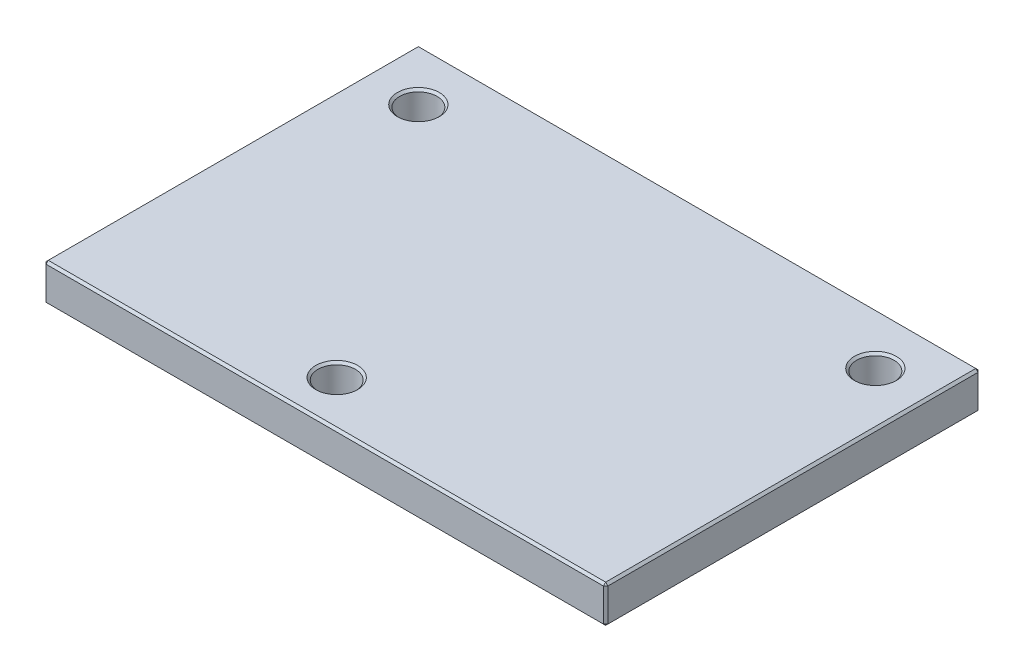
ISO-10303-21;
HEADER;
FILE_DESCRIPTION(('STEP AP214'),'2;1');
FILE_NAME('part.step','',(''),(''),'','','');
FILE_SCHEMA(('AUTOMOTIVE_DESIGN { 1 0 10303 214 1 1 1 1 }'));
ENDSEC;
DATA;
#1=APPLICATION_CONTEXT('core data for automotive mechanical design processes');
#2=APPLICATION_PROTOCOL_DEFINITION('international standard','automotive_design',2000,#1);
#3=PRODUCT_CONTEXT('',#1,'mechanical');
#4=PRODUCT('Part','Part','',(#3));
#5=PRODUCT_RELATED_PRODUCT_CATEGORY('part','',(#4));
#6=PRODUCT_DEFINITION_FORMATION('','',#4);
#7=PRODUCT_DEFINITION_CONTEXT('part definition',#1,'design');
#8=PRODUCT_DEFINITION('design','',#6,#7);
#9=PRODUCT_DEFINITION_SHAPE('','',#8);
#10=(LENGTH_UNIT() NAMED_UNIT(*) SI_UNIT(.MILLI.,.METRE.));
#11=(NAMED_UNIT(*) PLANE_ANGLE_UNIT() SI_UNIT($,.RADIAN.));
#12=(NAMED_UNIT(*) SI_UNIT($,.STERADIAN.) SOLID_ANGLE_UNIT());
#13=UNCERTAINTY_MEASURE_WITH_UNIT(LENGTH_MEASURE(1.E-05),#10,'distance_accuracy_value','');
#14=(GEOMETRIC_REPRESENTATION_CONTEXT(3) GLOBAL_UNCERTAINTY_ASSIGNED_CONTEXT((#13)) GLOBAL_UNIT_ASSIGNED_CONTEXT((#10,
#11,#12)) REPRESENTATION_CONTEXT('',''));
#15=CARTESIAN_POINT('',(0.,0.,0.));
#16=DIRECTION('',(0.,0.,1.));
#17=DIRECTION('',(1.,0.,0.));
#18=AXIS2_PLACEMENT_3D('',#15,#16,#17);
#19=CARTESIAN_POINT('',(375.,-50.,250.));
#20=DIRECTION('',(1.,0.,0.));
#21=DIRECTION('',(0.,0.,-1.));
#22=AXIS2_PLACEMENT_3D('',#19,#20,#21);
#23=PLANE('',#22);
#24=DIRECTION('',(0.,0.,-1.));
#25=VECTOR('',#24,1.);
#26=CARTESIAN_POINT('',(375.,-46.9999999999998,250.));
#27=LINE('',#26,#25);
#28=CARTESIAN_POINT('',(375.,-46.9999999999998,247.));
#29=VERTEX_POINT('',#28);
#30=CARTESIAN_POINT('',(375.,-46.9999999999998,-247.));
#31=VERTEX_POINT('',#30);
#32=EDGE_CURVE('E190',#29,#31,#27,.T.);
#33=ORIENTED_EDGE('',*,*,#32,.T.);
#34=DIRECTION('',(0.,1.,0.));
#35=VECTOR('',#34,1.);
#36=CARTESIAN_POINT('',(375.,-50.,-247.));
#37=LINE('',#36,#35);
#38=CARTESIAN_POINT('',(375.,-3.00000000000022,-247.));
#39=VERTEX_POINT('',#38);
#40=EDGE_CURVE('E192',#31,#39,#37,.T.);
#41=ORIENTED_EDGE('',*,*,#40,.T.);
#42=DIRECTION('',(0.,0.,1.));
#43=VECTOR('',#42,1.);
#44=CARTESIAN_POINT('',(375.,-3.00000000000022,250.));
#45=LINE('',#44,#43);
#46=CARTESIAN_POINT('',(375.,-3.00000000000022,247.));
#47=VERTEX_POINT('',#46);
#48=EDGE_CURVE('E188',#39,#47,#45,.T.);
#49=ORIENTED_EDGE('',*,*,#48,.T.);
#50=DIRECTION('',(0.,-1.,0.));
#51=VECTOR('',#50,1.);
#52=CARTESIAN_POINT('',(375.,-50.,247.));
#53=LINE('',#52,#51);
#54=EDGE_CURVE('E186',#47,#29,#53,.T.);
#55=ORIENTED_EDGE('',*,*,#54,.T.);
#56=EDGE_LOOP('',(#33,#41,#49,#55));
#57=FACE_BOUND('',#56,.T.);
#58=ADVANCED_FACE('F42',(#57),#23,.T.);
#59=CARTESIAN_POINT('',(-375.,-50.,250.));
#60=DIRECTION('',(0.,0.,1.));
#61=DIRECTION('',(1.,0.,0.));
#62=AXIS2_PLACEMENT_3D('',#59,#60,#61);
#63=PLANE('',#62);
#64=DIRECTION('',(1.,0.,0.));
#65=VECTOR('',#64,1.);
#66=CARTESIAN_POINT('',(-375.,-46.9999999999998,250.));
#67=LINE('',#66,#65);
#68=CARTESIAN_POINT('',(-372.,-46.9999999999998,250.));
#69=VERTEX_POINT('',#68);
#70=CARTESIAN_POINT('',(372.,-46.9999999999998,250.));
#71=VERTEX_POINT('',#70);
#72=EDGE_CURVE('E199',#69,#71,#67,.T.);
#73=ORIENTED_EDGE('',*,*,#72,.T.);
#74=DIRECTION('',(0.,1.,0.));
#75=VECTOR('',#74,1.);
#76=CARTESIAN_POINT('',(372.,-50.,250.));
#77=LINE('',#76,#75);
#78=CARTESIAN_POINT('',(372.,-3.00000000000022,250.));
#79=VERTEX_POINT('',#78);
#80=EDGE_CURVE('E201',#71,#79,#77,.T.);
#81=ORIENTED_EDGE('',*,*,#80,.T.);
#82=DIRECTION('',(-1.,0.,0.));
#83=VECTOR('',#82,1.);
#84=CARTESIAN_POINT('',(-375.,-3.00000000000022,250.));
#85=LINE('',#84,#83);
#86=CARTESIAN_POINT('',(-372.,-3.00000000000022,250.));
#87=VERTEX_POINT('',#86);
#88=EDGE_CURVE('E197',#79,#87,#85,.T.);
#89=ORIENTED_EDGE('',*,*,#88,.T.);
#90=DIRECTION('',(0.,-1.,0.));
#91=VECTOR('',#90,1.);
#92=CARTESIAN_POINT('',(-372.,-50.,250.));
#93=LINE('',#92,#91);
#94=EDGE_CURVE('E195',#87,#69,#93,.T.);
#95=ORIENTED_EDGE('',*,*,#94,.T.);
#96=EDGE_LOOP('',(#73,#81,#89,#95));
#97=FACE_BOUND('',#96,.T.);
#98=ADVANCED_FACE('F328',(#97),#63,.T.);
#99=CARTESIAN_POINT('',(-375.,-50.,250.));
#100=DIRECTION('',(-1.,0.,0.));
#101=DIRECTION('',(0.,0.,1.));
#102=AXIS2_PLACEMENT_3D('',#99,#100,#101);
#103=PLANE('',#102);
#104=DIRECTION('',(0.,0.,1.));
#105=VECTOR('',#104,1.);
#106=CARTESIAN_POINT('',(-375.,-46.9999999999998,250.));
#107=LINE('',#106,#105);
#108=CARTESIAN_POINT('',(-375.,-46.9999999999998,-247.));
#109=VERTEX_POINT('',#108);
#110=CARTESIAN_POINT('',(-375.,-46.9999999999998,247.));
#111=VERTEX_POINT('',#110);
#112=EDGE_CURVE('E52',#109,#111,#107,.T.);
#113=ORIENTED_EDGE('',*,*,#112,.T.);
#114=DIRECTION('',(0.,1.,0.));
#115=VECTOR('',#114,1.);
#116=CARTESIAN_POINT('',(-375.,-50.,247.));
#117=LINE('',#116,#115);
#118=CARTESIAN_POINT('',(-375.,-3.00000000000022,247.));
#119=VERTEX_POINT('',#118);
#120=EDGE_CURVE('E11',#111,#119,#117,.T.);
#121=ORIENTED_EDGE('',*,*,#120,.T.);
#122=DIRECTION('',(0.,0.,-1.));
#123=VECTOR('',#122,1.);
#124=CARTESIAN_POINT('',(-375.,-3.00000000000022,-250.));
#125=LINE('',#124,#123);
#126=CARTESIAN_POINT('',(-375.,-3.00000000000022,-247.));
#127=VERTEX_POINT('',#126);
#128=EDGE_CURVE('E204',#119,#127,#125,.T.);
#129=ORIENTED_EDGE('',*,*,#128,.T.);
#130=DIRECTION('',(0.,-1.,0.));
#131=VECTOR('',#130,1.);
#132=CARTESIAN_POINT('',(-375.,-50.,-247.));
#133=LINE('',#132,#131);
#134=EDGE_CURVE('E63',#127,#109,#133,.T.);
#135=ORIENTED_EDGE('',*,*,#134,.T.);
#136=EDGE_LOOP('',(#113,#121,#129,#135));
#137=FACE_BOUND('',#136,.T.);
#138=ADVANCED_FACE('F334',(#137),#103,.T.);
#139=CARTESIAN_POINT('',(-375.,-50.,-250.));
#140=DIRECTION('',(0.,0.,-1.));
#141=DIRECTION('',(-1.,0.,0.));
#142=AXIS2_PLACEMENT_3D('',#139,#140,#141);
#143=PLANE('',#142);
#144=DIRECTION('',(1.,0.,0.));
#145=VECTOR('',#144,1.);
#146=CARTESIAN_POINT('',(375.,-3.00000000000022,-250.));
#147=LINE('',#146,#145);
#148=CARTESIAN_POINT('',(-372.,-3.00000000000022,-250.));
#149=VERTEX_POINT('',#148);
#150=CARTESIAN_POINT('',(372.,-3.00000000000022,-250.));
#151=VERTEX_POINT('',#150);
#152=EDGE_CURVE('E159',#149,#151,#147,.T.);
#153=ORIENTED_EDGE('',*,*,#152,.T.);
#154=DIRECTION('',(0.,-1.,0.));
#155=VECTOR('',#154,1.);
#156=CARTESIAN_POINT('',(372.,-50.,-250.));
#157=LINE('',#156,#155);
#158=CARTESIAN_POINT('',(372.,-46.9999999999998,-250.));
#159=VERTEX_POINT('',#158);
#160=EDGE_CURVE('E164',#151,#159,#157,.T.);
#161=ORIENTED_EDGE('',*,*,#160,.T.);
#162=DIRECTION('',(-1.,0.,0.));
#163=VECTOR('',#162,1.);
#164=CARTESIAN_POINT('',(-375.,-46.9999999999998,-250.));
#165=LINE('',#164,#163);
#166=CARTESIAN_POINT('',(-372.,-46.9999999999998,-250.));
#167=VERTEX_POINT('',#166);
#168=EDGE_CURVE('E136',#159,#167,#165,.T.);
#169=ORIENTED_EDGE('',*,*,#168,.T.);
#170=DIRECTION('',(0.,1.,0.));
#171=VECTOR('',#170,1.);
#172=CARTESIAN_POINT('',(-372.,-50.,-250.));
#173=LINE('',#172,#171);
#174=EDGE_CURVE('E153',#167,#149,#173,.T.);
#175=ORIENTED_EDGE('',*,*,#174,.T.);
#176=EDGE_LOOP('',(#153,#161,#169,#175));
#177=FACE_BOUND('',#176,.T.);
#178=ADVANCED_FACE('F162',(#177),#143,.T.);
#179=CARTESIAN_POINT('',(0.,-50.,0.));
#180=DIRECTION('',(0.,-1.,0.));
#181=DIRECTION('',(0.,0.,-1.));
#182=AXIS2_PLACEMENT_3D('',#179,#180,#181);
#183=PLANE('',#182);
#184=DIRECTION('',(0.,0.,-1.));
#185=VECTOR('',#184,1.);
#186=CARTESIAN_POINT('',(-372.,-50.,0.));
#187=LINE('',#186,#185);
#188=CARTESIAN_POINT('',(-372.,-50.,247.));
#189=VERTEX_POINT('',#188);
#190=CARTESIAN_POINT('',(-372.,-50.,-247.));
#191=VERTEX_POINT('',#190);
#192=EDGE_CURVE('E167',#189,#191,#187,.T.);
#193=ORIENTED_EDGE('',*,*,#192,.T.);
#194=DIRECTION('',(1.,0.,0.));
#195=VECTOR('',#194,1.);
#196=CARTESIAN_POINT('',(0.,-50.,-247.));
#197=LINE('',#196,#195);
#198=CARTESIAN_POINT('',(372.,-50.,-247.));
#199=VERTEX_POINT('',#198);
#200=EDGE_CURVE('E138',#191,#199,#197,.T.);
#201=ORIENTED_EDGE('',*,*,#200,.T.);
#202=DIRECTION('',(0.,0.,1.));
#203=VECTOR('',#202,1.);
#204=CARTESIAN_POINT('',(372.,-50.,0.));
#205=LINE('',#204,#203);
#206=CARTESIAN_POINT('',(372.,-50.,247.));
#207=VERTEX_POINT('',#206);
#208=EDGE_CURVE('E174',#199,#207,#205,.T.);
#209=ORIENTED_EDGE('',*,*,#208,.T.);
#210=DIRECTION('',(-1.,0.,0.));
#211=VECTOR('',#210,1.);
#212=CARTESIAN_POINT('',(0.,-50.,247.));
#213=LINE('',#212,#211);
#214=EDGE_CURVE('E172',#207,#189,#213,.T.);
#215=ORIENTED_EDGE('',*,*,#214,.T.);
#216=EDGE_LOOP('',(#193,#201,#209,#215));
#217=FACE_BOUND('',#216,.T.);
#218=CARTESIAN_POINT('',(305.,-50.,-180.));
#219=DIRECTION('',(0.,-1.,0.));
#220=DIRECTION('',(0.,0.,-1.));
#221=AXIS2_PLACEMENT_3D('',#218,#219,#220);
#222=CIRCLE('',#221,28.);
#223=CARTESIAN_POINT('',(305.,-50.,-208.));
#224=VERTEX_POINT('',#223);
#225=EDGE_CURVE('E276',#224,#224,#222,.F.);
#226=ORIENTED_EDGE('',*,*,#225,.T.);
#227=EDGE_LOOP('',(#226));
#228=FACE_BOUND('',#227,.T.);
#229=CARTESIAN_POINT('',(-305.,-50.,-180.));
#230=DIRECTION('',(0.,-1.,0.));
#231=DIRECTION('',(0.,0.,-1.));
#232=AXIS2_PLACEMENT_3D('',#229,#230,#231);
#233=CIRCLE('',#232,28.);
#234=CARTESIAN_POINT('',(-305.,-50.,-208.));
#235=VERTEX_POINT('',#234);
#236=EDGE_CURVE('E271',#235,#235,#233,.F.);
#237=ORIENTED_EDGE('',*,*,#236,.T.);
#238=EDGE_LOOP('',(#237));
#239=FACE_BOUND('',#238,.T.);
#240=CARTESIAN_POINT('',(-44.,-50.,190.));
#241=DIRECTION('',(0.,-1.,0.));
#242=DIRECTION('',(0.,0.,-1.));
#243=AXIS2_PLACEMENT_3D('',#240,#241,#242);
#244=CIRCLE('',#243,28.);
#245=CARTESIAN_POINT('',(-44.,-50.,162.));
#246=VERTEX_POINT('',#245);
#247=EDGE_CURVE('E264',#246,#246,#244,.F.);
#248=ORIENTED_EDGE('',*,*,#247,.T.);
#249=EDGE_LOOP('',(#248));
#250=FACE_BOUND('',#249,.T.);
#251=ADVANCED_FACE('F484',(#217,#228,#239,#250),#183,.T.);
#252=CARTESIAN_POINT('',(0.,0.,0.));
#253=DIRECTION('',(0.,-1.,0.));
#254=DIRECTION('',(0.,0.,-1.));
#255=AXIS2_PLACEMENT_3D('',#252,#253,#254);
#256=PLANE('',#255);
#257=DIRECTION('',(0.,0.,-1.));
#258=VECTOR('',#257,1.);
#259=CARTESIAN_POINT('',(372.,0.,-250.));
#260=LINE('',#259,#258);
#261=CARTESIAN_POINT('',(372.,0.,247.));
#262=VERTEX_POINT('',#261);
#263=CARTESIAN_POINT('',(372.,0.,-247.));
#264=VERTEX_POINT('',#263);
#265=EDGE_CURVE('E181',#262,#264,#260,.T.);
#266=ORIENTED_EDGE('',*,*,#265,.T.);
#267=DIRECTION('',(-1.,0.,0.));
#268=VECTOR('',#267,1.);
#269=CARTESIAN_POINT('',(-375.,0.,-247.));
#270=LINE('',#269,#268);
#271=CARTESIAN_POINT('',(-372.,0.,-247.));
#272=VERTEX_POINT('',#271);
#273=EDGE_CURVE('E183',#264,#272,#270,.T.);
#274=ORIENTED_EDGE('',*,*,#273,.T.);
#275=DIRECTION('',(0.,0.,1.));
#276=VECTOR('',#275,1.);
#277=CARTESIAN_POINT('',(-372.,0.,250.));
#278=LINE('',#277,#276);
#279=CARTESIAN_POINT('',(-372.,0.,247.));
#280=VERTEX_POINT('',#279);
#281=EDGE_CURVE('E177',#272,#280,#278,.T.);
#282=ORIENTED_EDGE('',*,*,#281,.T.);
#283=DIRECTION('',(1.,0.,0.));
#284=VECTOR('',#283,1.);
#285=CARTESIAN_POINT('',(375.,0.,247.));
#286=LINE('',#285,#284);
#287=EDGE_CURVE('E179',#280,#262,#286,.T.);
#288=ORIENTED_EDGE('',*,*,#287,.T.);
#289=EDGE_LOOP('',(#266,#274,#282,#288));
#290=FACE_BOUND('',#289,.T.);
#291=CARTESIAN_POINT('',(305.,0.,-180.));
#292=DIRECTION('',(0.,-1.,0.));
#293=DIRECTION('',(0.,0.,-1.));
#294=AXIS2_PLACEMENT_3D('',#291,#292,#293);
#295=CIRCLE('',#294,28.0000000000001);
#296=CARTESIAN_POINT('',(305.,0.,-208.));
#297=VERTEX_POINT('',#296);
#298=EDGE_CURVE('E293',#297,#297,#295,.T.);
#299=ORIENTED_EDGE('',*,*,#298,.T.);
#300=EDGE_LOOP('',(#299));
#301=FACE_BOUND('',#300,.T.);
#302=CARTESIAN_POINT('',(-305.,0.,-180.));
#303=DIRECTION('',(0.,-1.,0.));
#304=DIRECTION('',(0.,0.,-1.));
#305=AXIS2_PLACEMENT_3D('',#302,#303,#304);
#306=CIRCLE('',#305,28.0000000000001);
#307=CARTESIAN_POINT('',(-305.,0.,-208.));
#308=VERTEX_POINT('',#307);
#309=EDGE_CURVE('E290',#308,#308,#306,.T.);
#310=ORIENTED_EDGE('',*,*,#309,.T.);
#311=EDGE_LOOP('',(#310));
#312=FACE_BOUND('',#311,.T.);
#313=CARTESIAN_POINT('',(-44.,0.,190.));
#314=DIRECTION('',(0.,-1.,0.));
#315=DIRECTION('',(0.,0.,-1.));
#316=AXIS2_PLACEMENT_3D('',#313,#314,#315);
#317=CIRCLE('',#316,28.0000000000001);
#318=CARTESIAN_POINT('',(-44.,0.,162.));
#319=VERTEX_POINT('',#318);
#320=EDGE_CURVE('E287',#319,#319,#317,.T.);
#321=ORIENTED_EDGE('',*,*,#320,.T.);
#322=EDGE_LOOP('',(#321));
#323=FACE_BOUND('',#322,.T.);
#324=ADVANCED_FACE('F525',(#290,#301,#312,#323),#256,.F.);
#325=CARTESIAN_POINT('',(-44.,-50.001,190.));
#326=DIRECTION('',(0.,1.,0.));
#327=DIRECTION('',(0.,0.,1.));
#328=AXIS2_PLACEMENT_3D('',#325,#326,#327);
#329=CYLINDRICAL_SURFACE('',#328,25.);
#330=CARTESIAN_POINT('',(-44.,-47.,190.));
#331=DIRECTION('',(0.,-1.,0.));
#332=DIRECTION('',(0.,0.,-1.));
#333=AXIS2_PLACEMENT_3D('',#330,#331,#332);
#334=CIRCLE('',#333,25.);
#335=CARTESIAN_POINT('',(-44.,-47.,165.));
#336=VERTEX_POINT('',#335);
#337=EDGE_CURVE('E160',#336,#336,#334,.T.);
#338=ORIENTED_EDGE('',*,*,#337,.T.);
#339=EDGE_LOOP('',(#338));
#340=FACE_BOUND('',#339,.T.);
#341=CARTESIAN_POINT('',(-44.,-3.00000000000001,190.));
#342=DIRECTION('',(0.,-1.,0.));
#343=DIRECTION('',(0.,0.,-1.));
#344=AXIS2_PLACEMENT_3D('',#341,#342,#343);
#345=CIRCLE('',#344,25.);
#346=CARTESIAN_POINT('',(-44.,-3.00000000000001,165.));
#347=VERTEX_POINT('',#346);
#348=EDGE_CURVE('E302',#347,#347,#345,.F.);
#349=ORIENTED_EDGE('',*,*,#348,.T.);
#350=EDGE_LOOP('',(#349));
#351=FACE_BOUND('',#350,.T.);
#352=ADVANCED_FACE('F308',(#340,#351),#329,.F.);
#353=CARTESIAN_POINT('',(305.,-50.001,-180.));
#354=DIRECTION('',(0.,1.,0.));
#355=DIRECTION('',(0.,0.,1.));
#356=AXIS2_PLACEMENT_3D('',#353,#354,#355);
#357=CYLINDRICAL_SURFACE('',#356,25.);
#358=CARTESIAN_POINT('',(305.,-47.,-180.));
#359=DIRECTION('',(0.,-1.,0.));
#360=DIRECTION('',(0.,0.,-1.));
#361=AXIS2_PLACEMENT_3D('',#358,#359,#360);
#362=CIRCLE('',#361,25.);
#363=CARTESIAN_POINT('',(305.,-47.,-205.));
#364=VERTEX_POINT('',#363);
#365=EDGE_CURVE('E284',#364,#364,#362,.T.);
#366=ORIENTED_EDGE('',*,*,#365,.T.);
#367=EDGE_LOOP('',(#366));
#368=FACE_BOUND('',#367,.T.);
#369=CARTESIAN_POINT('',(305.,-2.99999999999999,-180.));
#370=DIRECTION('',(0.,-1.,0.));
#371=DIRECTION('',(0.,0.,-1.));
#372=AXIS2_PLACEMENT_3D('',#369,#370,#371);
#373=CIRCLE('',#372,25.);
#374=CARTESIAN_POINT('',(305.,-2.99999999999999,-205.));
#375=VERTEX_POINT('',#374);
#376=EDGE_CURVE('E281',#375,#375,#373,.F.);
#377=ORIENTED_EDGE('',*,*,#376,.T.);
#378=EDGE_LOOP('',(#377));
#379=FACE_BOUND('',#378,.T.);
#380=ADVANCED_FACE('F537',(#368,#379),#357,.F.);
#381=CARTESIAN_POINT('',(-305.,-50.001,-180.));
#382=DIRECTION('',(0.,1.,0.));
#383=DIRECTION('',(0.,0.,1.));
#384=AXIS2_PLACEMENT_3D('',#381,#382,#383);
#385=CYLINDRICAL_SURFACE('',#384,25.);
#386=CARTESIAN_POINT('',(-305.,-47.,-180.));
#387=DIRECTION('',(0.,-1.,0.));
#388=DIRECTION('',(0.,0.,-1.));
#389=AXIS2_PLACEMENT_3D('',#386,#387,#388);
#390=CIRCLE('',#389,25.);
#391=CARTESIAN_POINT('',(-305.,-47.,-205.));
#392=VERTEX_POINT('',#391);
#393=EDGE_CURVE('E299',#392,#392,#390,.T.);
#394=ORIENTED_EDGE('',*,*,#393,.T.);
#395=EDGE_LOOP('',(#394));
#396=FACE_BOUND('',#395,.T.);
#397=CARTESIAN_POINT('',(-305.,-2.99999999999999,-180.));
#398=DIRECTION('',(0.,-1.,0.));
#399=DIRECTION('',(0.,0.,-1.));
#400=AXIS2_PLACEMENT_3D('',#397,#398,#399);
#401=CIRCLE('',#400,25.);
#402=CARTESIAN_POINT('',(-305.,-2.99999999999999,-205.));
#403=VERTEX_POINT('',#402);
#404=EDGE_CURVE('E296',#403,#403,#401,.F.);
#405=ORIENTED_EDGE('',*,*,#404,.T.);
#406=EDGE_LOOP('',(#405));
#407=FACE_BOUND('',#406,.T.);
#408=ADVANCED_FACE('F348',(#396,#407),#385,.F.);
#409=CARTESIAN_POINT('',(305.,-50.,-180.));
#410=DIRECTION('',(0.,-1.,0.));
#411=DIRECTION('',(0.,0.,-1.));
#412=AXIS2_PLACEMENT_3D('',#409,#410,#411);
#413=CONICAL_SURFACE('',#412,28.,0.785398163397452);
#414=ORIENTED_EDGE('',*,*,#365,.F.);
#415=EDGE_LOOP('',(#414));
#416=FACE_BOUND('',#415,.T.);
#417=ORIENTED_EDGE('',*,*,#225,.F.);
#418=EDGE_LOOP('',(#417));
#419=FACE_BOUND('',#418,.T.);
#420=ADVANCED_FACE('F341',(#416,#419),#413,.F.);
#421=CARTESIAN_POINT('',(305.,-2.99999999999999,-180.));
#422=DIRECTION('',(0.,1.,0.));
#423=DIRECTION('',(0.,0.,1.));
#424=AXIS2_PLACEMENT_3D('',#421,#422,#423);
#425=CONICAL_SURFACE('',#424,25.,0.785398163397471);
#426=ORIENTED_EDGE('',*,*,#298,.F.);
#427=EDGE_LOOP('',(#426));
#428=FACE_BOUND('',#427,.T.);
#429=ORIENTED_EDGE('',*,*,#376,.F.);
#430=EDGE_LOOP('',(#429));
#431=FACE_BOUND('',#430,.T.);
#432=ADVANCED_FACE('F347',(#428,#431),#425,.F.);
#433=CARTESIAN_POINT('',(-305.,-50.,-180.));
#434=DIRECTION('',(0.,-1.,0.));
#435=DIRECTION('',(0.,0.,-1.));
#436=AXIS2_PLACEMENT_3D('',#433,#434,#435);
#437=CONICAL_SURFACE('',#436,28.,0.785398163397452);
#438=ORIENTED_EDGE('',*,*,#393,.F.);
#439=EDGE_LOOP('',(#438));
#440=FACE_BOUND('',#439,.T.);
#441=ORIENTED_EDGE('',*,*,#236,.F.);
#442=EDGE_LOOP('',(#441));
#443=FACE_BOUND('',#442,.T.);
#444=ADVANCED_FACE('F323',(#440,#443),#437,.F.);
#445=CARTESIAN_POINT('',(-305.,-2.99999999999999,-180.));
#446=DIRECTION('',(0.,1.,0.));
#447=DIRECTION('',(0.,0.,1.));
#448=AXIS2_PLACEMENT_3D('',#445,#446,#447);
#449=CONICAL_SURFACE('',#448,25.,0.785398163397471);
#450=ORIENTED_EDGE('',*,*,#309,.F.);
#451=EDGE_LOOP('',(#450));
#452=FACE_BOUND('',#451,.T.);
#453=ORIENTED_EDGE('',*,*,#404,.F.);
#454=EDGE_LOOP('',(#453));
#455=FACE_BOUND('',#454,.T.);
#456=ADVANCED_FACE('F315',(#452,#455),#449,.F.);
#457=CARTESIAN_POINT('',(-44.,-50.,190.));
#458=DIRECTION('',(0.,-1.,0.));
#459=DIRECTION('',(0.,0.,-1.));
#460=AXIS2_PLACEMENT_3D('',#457,#458,#459);
#461=CONICAL_SURFACE('',#460,28.,0.785398163397452);
#462=ORIENTED_EDGE('',*,*,#337,.F.);
#463=EDGE_LOOP('',(#462));
#464=FACE_BOUND('',#463,.T.);
#465=ORIENTED_EDGE('',*,*,#247,.F.);
#466=EDGE_LOOP('',(#465));
#467=FACE_BOUND('',#466,.T.);
#468=ADVANCED_FACE('F311',(#464,#467),#461,.F.);
#469=CARTESIAN_POINT('',(-44.,-3.00000000000001,190.));
#470=DIRECTION('',(0.,1.,0.));
#471=DIRECTION('',(0.,0.,1.));
#472=AXIS2_PLACEMENT_3D('',#469,#470,#471);
#473=CONICAL_SURFACE('',#472,25.,0.78539816339747);
#474=ORIENTED_EDGE('',*,*,#320,.F.);
#475=EDGE_LOOP('',(#474));
#476=FACE_BOUND('',#475,.T.);
#477=ORIENTED_EDGE('',*,*,#348,.F.);
#478=EDGE_LOOP('',(#477));
#479=FACE_BOUND('',#478,.T.);
#480=ADVANCED_FACE('F314',(#476,#479),#473,.F.);
#481=CARTESIAN_POINT('',(0.,0.,247.));
#482=DIRECTION('',(0.,0.707106781186547,0.707106781186547));
#483=DIRECTION('',(-1.,0.,0.));
#484=AXIS2_PLACEMENT_3D('',#481,#482,#483);
#485=PLANE('',#484);
#486=DIRECTION('',(0.,-0.707106781186547,0.707106781186547));
#487=VECTOR('',#486,1.);
#488=CARTESIAN_POINT('',(372.,-1.50000000000011,248.5));
#489=LINE('',#488,#487);
#490=EDGE_CURVE('E47',#262,#79,#489,.T.);
#491=ORIENTED_EDGE('',*,*,#490,.F.);
#492=ORIENTED_EDGE('',*,*,#287,.F.);
#493=DIRECTION('',(0.,0.707106781186547,-0.707106781186547));
#494=VECTOR('',#493,1.);
#495=CARTESIAN_POINT('',(-372.,-3.00000000000022,250.));
#496=LINE('',#495,#494);
#497=EDGE_CURVE('E257',#87,#280,#496,.T.);
#498=ORIENTED_EDGE('',*,*,#497,.F.);
#499=ORIENTED_EDGE('',*,*,#88,.F.);
#500=EDGE_LOOP('',(#491,#492,#498,#499));
#501=FACE_BOUND('',#500,.T.);
#502=ADVANCED_FACE('F45',(#501),#485,.T.);
#503=CARTESIAN_POINT('',(375.,-3.00000000000022,247.));
#504=DIRECTION('',(0.577350269189626,0.577350269189626,0.577350269189626));
#505=DIRECTION('',(0.707106781186547,0.,-0.707106781186547));
#506=AXIS2_PLACEMENT_3D('',#503,#504,#505);
#507=PLANE('',#506);
#508=DIRECTION('',(-0.707106781186547,0.707106781186547,0.));
#509=VECTOR('',#508,1.);
#510=CARTESIAN_POINT('',(375.,-3.00000000000022,247.));
#511=LINE('',#510,#509);
#512=EDGE_CURVE('E253',#262,#47,#511,.F.);
#513=ORIENTED_EDGE('',*,*,#512,.F.);
#514=ORIENTED_EDGE('',*,*,#490,.T.);
#515=DIRECTION('',(-0.707106781186547,0.,0.707106781186547));
#516=VECTOR('',#515,1.);
#517=CARTESIAN_POINT('',(375.,-3.00000000000022,247.));
#518=LINE('',#517,#516);
#519=EDGE_CURVE('E256',#47,#79,#518,.T.);
#520=ORIENTED_EDGE('',*,*,#519,.F.);
#521=EDGE_LOOP('',(#513,#514,#520));
#522=FACE_BOUND('',#521,.T.);
#523=ADVANCED_FACE('F375',(#522),#507,.T.);
#524=CARTESIAN_POINT('',(-372.,-3.00000000000022,250.));
#525=DIRECTION('',(-0.577350269189626,0.577350269189626,0.577350269189626));
#526=DIRECTION('',(0.707106781186547,0.,0.707106781186547));
#527=AXIS2_PLACEMENT_3D('',#524,#525,#526);
#528=PLANE('',#527);
#529=DIRECTION('',(-0.707106781186547,0.,-0.707106781186547));
#530=VECTOR('',#529,1.);
#531=CARTESIAN_POINT('',(-372.,-3.00000000000022,250.));
#532=LINE('',#531,#530);
#533=EDGE_CURVE('E247',#87,#119,#532,.T.);
#534=ORIENTED_EDGE('',*,*,#533,.F.);
#535=ORIENTED_EDGE('',*,*,#497,.T.);
#536=DIRECTION('',(-0.707106781186547,-0.707106781186547,0.));
#537=VECTOR('',#536,1.);
#538=CARTESIAN_POINT('',(-373.5,-1.50000000000011,247.));
#539=LINE('',#538,#537);
#540=EDGE_CURVE('E250',#119,#280,#539,.F.);
#541=ORIENTED_EDGE('',*,*,#540,.F.);
#542=EDGE_LOOP('',(#534,#535,#541));
#543=FACE_BOUND('',#542,.T.);
#544=ADVANCED_FACE('F380',(#543),#528,.T.);
#545=CARTESIAN_POINT('',(372.,-50.,250.));
#546=DIRECTION('',(-0.707106781186547,0.,-0.707106781186547));
#547=DIRECTION('',(0.,1.,0.));
#548=AXIS2_PLACEMENT_3D('',#545,#546,#547);
#549=PLANE('',#548);
#550=ORIENTED_EDGE('',*,*,#519,.T.);
#551=ORIENTED_EDGE('',*,*,#80,.F.);
#552=DIRECTION('',(0.707106781186547,0.,-0.707106781186547));
#553=VECTOR('',#552,1.);
#554=CARTESIAN_POINT('',(373.5,-46.9999999999998,248.5));
#555=LINE('',#554,#553);
#556=EDGE_CURVE('E241',#29,#71,#555,.F.);
#557=ORIENTED_EDGE('',*,*,#556,.F.);
#558=ORIENTED_EDGE('',*,*,#54,.F.);
#559=EDGE_LOOP('',(#550,#551,#557,#558));
#560=FACE_BOUND('',#559,.T.);
#561=ADVANCED_FACE('F385',(#560),#549,.F.);
#562=CARTESIAN_POINT('',(372.,0.,0.));
#563=DIRECTION('',(0.707106781186547,0.707106781186547,0.));
#564=DIRECTION('',(0.,0.,1.));
#565=AXIS2_PLACEMENT_3D('',#562,#563,#564);
#566=PLANE('',#565);
#567=ORIENTED_EDGE('',*,*,#512,.T.);
#568=ORIENTED_EDGE('',*,*,#48,.F.);
#569=DIRECTION('',(0.707106781186548,-0.707106781186548,0.));
#570=VECTOR('',#569,1.);
#571=CARTESIAN_POINT('',(373.5,-1.5000000000001,-247.));
#572=LINE('',#571,#570);
#573=EDGE_CURVE('E238',#264,#39,#572,.T.);
#574=ORIENTED_EDGE('',*,*,#573,.F.);
#575=ORIENTED_EDGE('',*,*,#265,.F.);
#576=EDGE_LOOP('',(#567,#568,#574,#575));
#577=FACE_BOUND('',#576,.T.);
#578=ADVANCED_FACE('F390',(#577),#566,.T.);
#579=CARTESIAN_POINT('',(0.,0.,-247.));
#580=DIRECTION('',(0.,0.707106781186547,-0.707106781186547));
#581=DIRECTION('',(1.,0.,0.));
#582=AXIS2_PLACEMENT_3D('',#579,#580,#581);
#583=PLANE('',#582);
#584=DIRECTION('',(0.,-0.707106781186548,-0.707106781186548));
#585=VECTOR('',#584,1.);
#586=CARTESIAN_POINT('',(-372.,0.,-247.));
#587=LINE('',#586,#585);
#588=EDGE_CURVE('E232',#272,#149,#587,.T.);
#589=ORIENTED_EDGE('',*,*,#588,.F.);
#590=ORIENTED_EDGE('',*,*,#273,.F.);
#591=DIRECTION('',(0.,0.707106781186548,0.707106781186548));
#592=VECTOR('',#591,1.);
#593=CARTESIAN_POINT('',(372.,-3.00000000000022,-250.));
#594=LINE('',#593,#592);
#595=EDGE_CURVE('E235',#151,#264,#594,.T.);
#596=ORIENTED_EDGE('',*,*,#595,.F.);
#597=ORIENTED_EDGE('',*,*,#152,.F.);
#598=EDGE_LOOP('',(#589,#590,#596,#597));
#599=FACE_BOUND('',#598,.T.);
#600=ADVANCED_FACE('F395',(#599),#583,.T.);
#601=CARTESIAN_POINT('',(-372.,0.,0.));
#602=DIRECTION('',(-0.707106781186547,0.707106781186547,0.));
#603=DIRECTION('',(0.,0.,-1.));
#604=AXIS2_PLACEMENT_3D('',#601,#602,#603);
#605=PLANE('',#604);
#606=ORIENTED_EDGE('',*,*,#540,.T.);
#607=ORIENTED_EDGE('',*,*,#281,.F.);
#608=DIRECTION('',(0.707106781186548,0.707106781186548,0.));
#609=VECTOR('',#608,1.);
#610=CARTESIAN_POINT('',(-372.,0.,-247.));
#611=LINE('',#610,#609);
#612=EDGE_CURVE('E230',#127,#272,#611,.T.);
#613=ORIENTED_EDGE('',*,*,#612,.F.);
#614=ORIENTED_EDGE('',*,*,#128,.F.);
#615=EDGE_LOOP('',(#606,#607,#613,#614));
#616=FACE_BOUND('',#615,.T.);
#617=ADVANCED_FACE('F400',(#616),#605,.T.);
#618=CARTESIAN_POINT('',(-375.,-50.,247.));
#619=DIRECTION('',(0.707106781186547,0.,-0.707106781186547));
#620=DIRECTION('',(0.,1.,0.));
#621=AXIS2_PLACEMENT_3D('',#618,#619,#620);
#622=PLANE('',#621);
#623=ORIENTED_EDGE('',*,*,#533,.T.);
#624=ORIENTED_EDGE('',*,*,#120,.F.);
#625=DIRECTION('',(0.707106781186547,0.,0.707106781186547));
#626=VECTOR('',#625,1.);
#627=CARTESIAN_POINT('',(-373.5,-46.9999999999998,248.5));
#628=LINE('',#627,#626);
#629=EDGE_CURVE('E227',#69,#111,#628,.F.);
#630=ORIENTED_EDGE('',*,*,#629,.F.);
#631=ORIENTED_EDGE('',*,*,#94,.F.);
#632=EDGE_LOOP('',(#623,#624,#630,#631));
#633=FACE_BOUND('',#632,.T.);
#634=ADVANCED_FACE('F405',(#633),#622,.F.);
#635=CARTESIAN_POINT('',(-375.,-46.9999999999998,250.));
#636=DIRECTION('',(0.,0.707106781186547,-0.707106781186547));
#637=DIRECTION('',(1.,0.,0.));
#638=AXIS2_PLACEMENT_3D('',#635,#636,#637);
#639=PLANE('',#638);
#640=DIRECTION('',(0.,0.707106781186547,0.707106781186547));
#641=VECTOR('',#640,1.);
#642=CARTESIAN_POINT('',(372.,-50.,247.));
#643=LINE('',#642,#641);
#644=EDGE_CURVE('E244',#71,#207,#643,.F.);
#645=ORIENTED_EDGE('',*,*,#644,.F.);
#646=ORIENTED_EDGE('',*,*,#72,.F.);
#647=DIRECTION('',(0.,-0.707106781186547,-0.707106781186547));
#648=VECTOR('',#647,1.);
#649=CARTESIAN_POINT('',(-372.,-50.,247.));
#650=LINE('',#649,#648);
#651=EDGE_CURVE('E224',#189,#69,#650,.F.);
#652=ORIENTED_EDGE('',*,*,#651,.F.);
#653=ORIENTED_EDGE('',*,*,#214,.F.);
#654=EDGE_LOOP('',(#645,#646,#652,#653));
#655=FACE_BOUND('',#654,.T.);
#656=ADVANCED_FACE('F410',(#655),#639,.F.);
#657=CARTESIAN_POINT('',(372.,-50.,247.));
#658=DIRECTION('',(0.577350269189626,-0.577350269189626,0.577350269189626));
#659=DIRECTION('',(0.707106781186547,0.,-0.707106781186547));
#660=AXIS2_PLACEMENT_3D('',#657,#658,#659);
#661=PLANE('',#660);
#662=ORIENTED_EDGE('',*,*,#556,.T.);
#663=ORIENTED_EDGE('',*,*,#644,.T.);
#664=DIRECTION('',(-0.707106781186547,-0.707106781186547,0.));
#665=VECTOR('',#664,1.);
#666=CARTESIAN_POINT('',(372.,-50.,247.));
#667=LINE('',#666,#665);
#668=EDGE_CURVE('E221',#29,#207,#667,.T.);
#669=ORIENTED_EDGE('',*,*,#668,.F.);
#670=EDGE_LOOP('',(#662,#663,#669));
#671=FACE_BOUND('',#670,.T.);
#672=ADVANCED_FACE('F415',(#671),#661,.T.);
#673=CARTESIAN_POINT('',(372.,-3.00000000000022,-250.));
#674=DIRECTION('',(0.577350269189629,0.577350269189624,-0.577350269189624));
#675=DIRECTION('',(-0.707106781186544,0.,-0.707106781186551));
#676=AXIS2_PLACEMENT_3D('',#673,#674,#675);
#677=PLANE('',#676);
#678=ORIENTED_EDGE('',*,*,#595,.T.);
#679=ORIENTED_EDGE('',*,*,#573,.T.);
#680=DIRECTION('',(0.707106781186544,0.,0.707106781186551));
#681=VECTOR('',#680,1.);
#682=CARTESIAN_POINT('',(372.,-3.00000000000022,-250.));
#683=LINE('',#682,#681);
#684=EDGE_CURVE('E219',#151,#39,#683,.T.);
#685=ORIENTED_EDGE('',*,*,#684,.F.);
#686=EDGE_LOOP('',(#678,#679,#685));
#687=FACE_BOUND('',#686,.T.);
#688=ADVANCED_FACE('F420',(#687),#677,.T.);
#689=CARTESIAN_POINT('',(-372.,0.,-247.));
#690=DIRECTION('',(-0.577350269189629,0.577350269189624,-0.577350269189624));
#691=DIRECTION('',(-0.707106781186544,0.,0.707106781186551));
#692=AXIS2_PLACEMENT_3D('',#689,#690,#691);
#693=PLANE('',#692);
#694=ORIENTED_EDGE('',*,*,#612,.T.);
#695=ORIENTED_EDGE('',*,*,#588,.T.);
#696=DIRECTION('',(0.707106781186544,0.,-0.707106781186551));
#697=VECTOR('',#696,1.);
#698=CARTESIAN_POINT('',(-373.5,-3.00000000000022,-248.5));
#699=LINE('',#698,#697);
#700=EDGE_CURVE('E156',#127,#149,#699,.T.);
#701=ORIENTED_EDGE('',*,*,#700,.F.);
#702=EDGE_LOOP('',(#694,#695,#701));
#703=FACE_BOUND('',#702,.T.);
#704=ADVANCED_FACE('F425',(#703),#693,.T.);
#705=CARTESIAN_POINT('',(-372.,-50.,247.));
#706=DIRECTION('',(-0.577350269189626,-0.577350269189626,0.577350269189626));
#707=DIRECTION('',(0.707106781186547,0.,0.707106781186547));
#708=AXIS2_PLACEMENT_3D('',#705,#706,#707);
#709=PLANE('',#708);
#710=ORIENTED_EDGE('',*,*,#651,.T.);
#711=ORIENTED_EDGE('',*,*,#629,.T.);
#712=DIRECTION('',(-0.707106781186547,0.707106781186547,0.));
#713=VECTOR('',#712,1.);
#714=CARTESIAN_POINT('',(-372.,-50.,247.));
#715=LINE('',#714,#713);
#716=EDGE_CURVE('E215',#189,#111,#715,.T.);
#717=ORIENTED_EDGE('',*,*,#716,.F.);
#718=EDGE_LOOP('',(#710,#711,#717));
#719=FACE_BOUND('',#718,.T.);
#720=ADVANCED_FACE('F430',(#719),#709,.T.);
#721=CARTESIAN_POINT('',(375.,-46.9999999999998,250.));
#722=DIRECTION('',(-0.707106781186547,0.707106781186547,0.));
#723=DIRECTION('',(0.,0.,-1.));
#724=AXIS2_PLACEMENT_3D('',#721,#722,#723);
#725=PLANE('',#724);
#726=ORIENTED_EDGE('',*,*,#668,.T.);
#727=ORIENTED_EDGE('',*,*,#208,.F.);
#728=DIRECTION('',(0.707106781186548,0.707106781186548,0.));
#729=VECTOR('',#728,1.);
#730=CARTESIAN_POINT('',(372.,-50.,-247.));
#731=LINE('',#730,#729);
#732=EDGE_CURVE('E212',#31,#199,#731,.F.);
#733=ORIENTED_EDGE('',*,*,#732,.F.);
#734=ORIENTED_EDGE('',*,*,#32,.F.);
#735=EDGE_LOOP('',(#726,#727,#733,#734));
#736=FACE_BOUND('',#735,.T.);
#737=ADVANCED_FACE('F435',(#736),#725,.F.);
#738=CARTESIAN_POINT('',(375.,-50.,-247.));
#739=DIRECTION('',(-0.707106781186551,0.,0.707106781186544));
#740=DIRECTION('',(0.,1.,0.));
#741=AXIS2_PLACEMENT_3D('',#738,#739,#740);
#742=PLANE('',#741);
#743=ORIENTED_EDGE('',*,*,#684,.T.);
#744=ORIENTED_EDGE('',*,*,#40,.F.);
#745=DIRECTION('',(-0.707106781186544,0.,-0.707106781186551));
#746=VECTOR('',#745,1.);
#747=CARTESIAN_POINT('',(373.5,-46.9999999999998,-248.5));
#748=LINE('',#747,#746);
#749=EDGE_CURVE('E150',#159,#31,#748,.F.);
#750=ORIENTED_EDGE('',*,*,#749,.F.);
#751=ORIENTED_EDGE('',*,*,#160,.F.);
#752=EDGE_LOOP('',(#743,#744,#750,#751));
#753=FACE_BOUND('',#752,.T.);
#754=ADVANCED_FACE('F440',(#753),#742,.F.);
#755=CARTESIAN_POINT('',(-372.,-50.,-250.));
#756=DIRECTION('',(0.707106781186551,0.,0.707106781186544));
#757=DIRECTION('',(0.,1.,0.));
#758=AXIS2_PLACEMENT_3D('',#755,#756,#757);
#759=PLANE('',#758);
#760=ORIENTED_EDGE('',*,*,#700,.T.);
#761=ORIENTED_EDGE('',*,*,#174,.F.);
#762=DIRECTION('',(-0.707106781186544,0.,0.707106781186551));
#763=VECTOR('',#762,1.);
#764=CARTESIAN_POINT('',(-372.,-46.9999999999998,-250.));
#765=LINE('',#764,#763);
#766=EDGE_CURVE('E144',#109,#167,#765,.F.);
#767=ORIENTED_EDGE('',*,*,#766,.F.);
#768=ORIENTED_EDGE('',*,*,#134,.F.);
#769=EDGE_LOOP('',(#760,#761,#767,#768));
#770=FACE_BOUND('',#769,.T.);
#771=ADVANCED_FACE('F154',(#770),#759,.F.);
#772=CARTESIAN_POINT('',(-375.,-46.9999999999998,250.));
#773=DIRECTION('',(0.707106781186547,0.707106781186547,0.));
#774=DIRECTION('',(0.,0.,1.));
#775=AXIS2_PLACEMENT_3D('',#772,#773,#774);
#776=PLANE('',#775);
#777=ORIENTED_EDGE('',*,*,#716,.T.);
#778=ORIENTED_EDGE('',*,*,#112,.F.);
#779=DIRECTION('',(0.707106781186548,-0.707106781186548,0.));
#780=VECTOR('',#779,1.);
#781=CARTESIAN_POINT('',(-373.5,-48.4999999999999,-247.));
#782=LINE('',#781,#780);
#783=EDGE_CURVE('E148',#191,#109,#782,.F.);
#784=ORIENTED_EDGE('',*,*,#783,.F.);
#785=ORIENTED_EDGE('',*,*,#192,.F.);
#786=EDGE_LOOP('',(#777,#778,#784,#785));
#787=FACE_BOUND('',#786,.T.);
#788=ADVANCED_FACE('F449',(#787),#776,.F.);
#789=CARTESIAN_POINT('',(372.,-50.,-247.));
#790=DIRECTION('',(0.577350269189629,-0.577350269189624,-0.577350269189624));
#791=DIRECTION('',(-0.707106781186544,0.,-0.707106781186551));
#792=AXIS2_PLACEMENT_3D('',#789,#790,#791);
#793=PLANE('',#792);
#794=ORIENTED_EDGE('',*,*,#749,.T.);
#795=ORIENTED_EDGE('',*,*,#732,.T.);
#796=DIRECTION('',(0.,-0.707106781186548,0.707106781186548));
#797=VECTOR('',#796,1.);
#798=CARTESIAN_POINT('',(372.,-50.,-247.));
#799=LINE('',#798,#797);
#800=EDGE_CURVE('E141',#159,#199,#799,.T.);
#801=ORIENTED_EDGE('',*,*,#800,.F.);
#802=EDGE_LOOP('',(#794,#795,#801));
#803=FACE_BOUND('',#802,.T.);
#804=ADVANCED_FACE('F454',(#803),#793,.T.);
#805=CARTESIAN_POINT('',(-372.,-46.9999999999998,-250.));
#806=DIRECTION('',(-0.577350269189629,-0.577350269189624,-0.577350269189624));
#807=DIRECTION('',(-0.707106781186544,0.,0.707106781186551));
#808=AXIS2_PLACEMENT_3D('',#805,#806,#807);
#809=PLANE('',#808);
#810=ORIENTED_EDGE('',*,*,#783,.T.);
#811=ORIENTED_EDGE('',*,*,#766,.T.);
#812=DIRECTION('',(0.,0.707106781186548,-0.707106781186548));
#813=VECTOR('',#812,1.);
#814=CARTESIAN_POINT('',(-372.,-46.9999999999998,-250.));
#815=LINE('',#814,#813);
#816=EDGE_CURVE('E132',#191,#167,#815,.T.);
#817=ORIENTED_EDGE('',*,*,#816,.F.);
#818=EDGE_LOOP('',(#810,#811,#817));
#819=FACE_BOUND('',#818,.T.);
#820=ADVANCED_FACE('F146',(#819),#809,.T.);
#821=CARTESIAN_POINT('',(-375.,-46.9999999999998,-250.));
#822=DIRECTION('',(0.,0.707106781186547,0.707106781186547));
#823=DIRECTION('',(-1.,0.,0.));
#824=AXIS2_PLACEMENT_3D('',#821,#822,#823);
#825=PLANE('',#824);
#826=ORIENTED_EDGE('',*,*,#800,.T.);
#827=ORIENTED_EDGE('',*,*,#200,.F.);
#828=ORIENTED_EDGE('',*,*,#816,.T.);
#829=ORIENTED_EDGE('',*,*,#168,.F.);
#830=EDGE_LOOP('',(#826,#827,#828,#829));
#831=FACE_BOUND('',#830,.T.);
#832=ADVANCED_FACE('F134',(#831),#825,.F.);
#833=CLOSED_SHELL('',(#58,#98,#138,#178,#251,#324,#352,#380,#408,#420,#432,#444,#456,#468,#480,
#502,#523,#544,#561,#578,#600,#617,#634,#656,#672,#688,#704,#720,#737,#754,#771,#788,#804,#820,#832));
#834=MANIFOLD_SOLID_BREP('B2',#833);
#835=ADVANCED_BREP_SHAPE_REPRESENTATION('',(#18,#834),#14);
#836=SHAPE_DEFINITION_REPRESENTATION(#9,#835);
ENDSEC;
END-ISO-10303-21;
